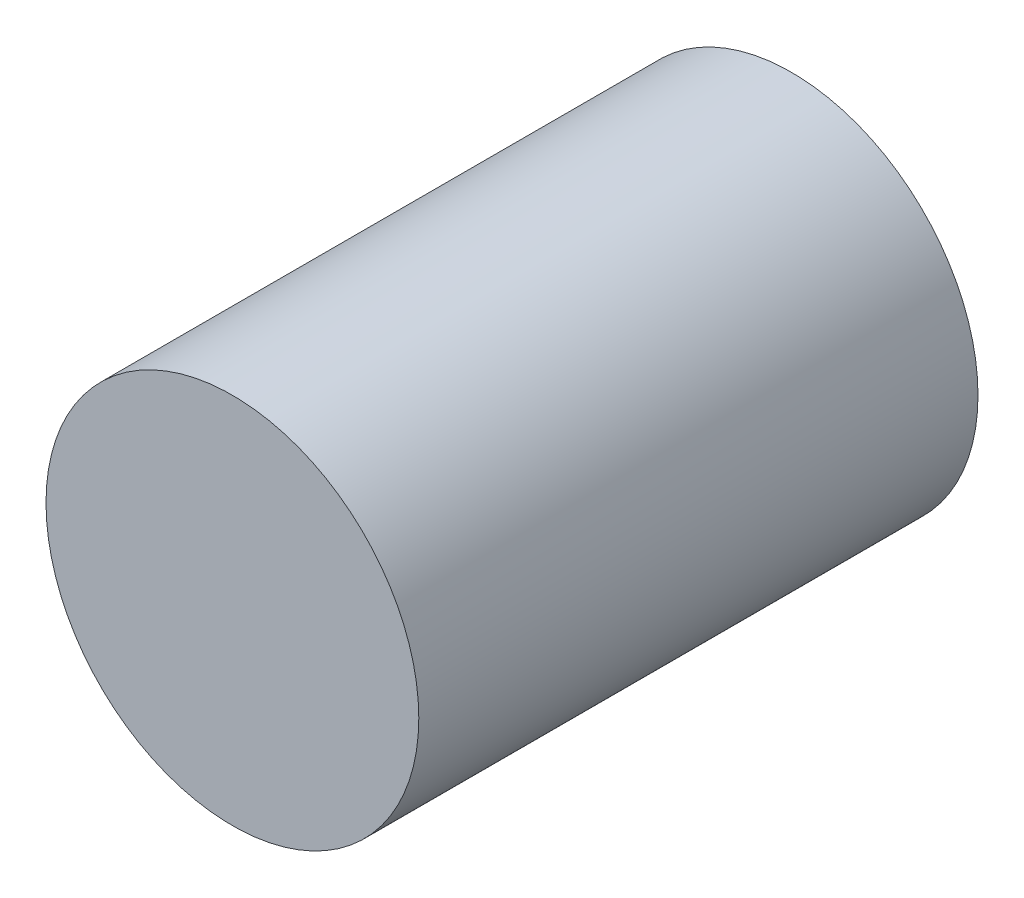
ISO-10303-21;
HEADER;
FILE_DESCRIPTION(('STEP AP214'),'2;1');
FILE_NAME('part.step','',(''),(''),'','','');
FILE_SCHEMA(('AUTOMOTIVE_DESIGN { 1 0 10303 214 1 1 1 1 }'));
ENDSEC;
DATA;
#1=APPLICATION_CONTEXT('core data for automotive mechanical design processes');
#2=APPLICATION_PROTOCOL_DEFINITION('international standard','automotive_design',2000,#1);
#3=PRODUCT_CONTEXT('',#1,'mechanical');
#4=PRODUCT('Part','Part','',(#3));
#5=PRODUCT_RELATED_PRODUCT_CATEGORY('part','',(#4));
#6=PRODUCT_DEFINITION_FORMATION('','',#4);
#7=PRODUCT_DEFINITION_CONTEXT('part definition',#1,'design');
#8=PRODUCT_DEFINITION('design','',#6,#7);
#9=PRODUCT_DEFINITION_SHAPE('','',#8);
#10=(LENGTH_UNIT() NAMED_UNIT(*) SI_UNIT(.MILLI.,.METRE.));
#11=(NAMED_UNIT(*) PLANE_ANGLE_UNIT() SI_UNIT($,.RADIAN.));
#12=(NAMED_UNIT(*) SI_UNIT($,.STERADIAN.) SOLID_ANGLE_UNIT());
#13=UNCERTAINTY_MEASURE_WITH_UNIT(LENGTH_MEASURE(1.E-05),#10,'distance_accuracy_value','');
#14=(GEOMETRIC_REPRESENTATION_CONTEXT(3) GLOBAL_UNCERTAINTY_ASSIGNED_CONTEXT((#13)) GLOBAL_UNIT_ASSIGNED_CONTEXT((#10,
#11,#12)) REPRESENTATION_CONTEXT('',''));
#15=CARTESIAN_POINT('',(0.,0.,0.));
#16=DIRECTION('',(0.,0.,1.));
#17=DIRECTION('',(1.,0.,0.));
#18=AXIS2_PLACEMENT_3D('',#15,#16,#17);
#19=CARTESIAN_POINT('',(0.,0.,24.));
#20=DIRECTION('',(0.,0.,-1.));
#21=DIRECTION('',(-1.,0.,0.));
#22=AXIS2_PLACEMENT_3D('',#19,#20,#21);
#23=CYLINDRICAL_SURFACE('',#22,8.);
#24=CARTESIAN_POINT('',(0.,0.,24.));
#25=DIRECTION('',(0.,0.,1.));
#26=DIRECTION('',(1.,0.,0.));
#27=AXIS2_PLACEMENT_3D('',#24,#25,#26);
#28=CIRCLE('',#27,8.);
#29=CARTESIAN_POINT('',(8.,0.,24.));
#30=VERTEX_POINT('',#29);
#31=EDGE_CURVE('E10',#30,#30,#28,.T.);
#32=ORIENTED_EDGE('',*,*,#31,.F.);
#33=EDGE_LOOP('',(#32));
#34=FACE_BOUND('',#33,.T.);
#35=CARTESIAN_POINT('',(0.,0.,0.));
#36=DIRECTION('',(0.,0.,1.));
#37=DIRECTION('',(1.,0.,0.));
#38=AXIS2_PLACEMENT_3D('',#35,#36,#37);
#39=CIRCLE('',#38,8.);
#40=CARTESIAN_POINT('',(8.,0.,0.));
#41=VERTEX_POINT('',#40);
#42=EDGE_CURVE('E40',#41,#41,#39,.T.);
#43=ORIENTED_EDGE('',*,*,#42,.T.);
#44=EDGE_LOOP('',(#43));
#45=FACE_BOUND('',#44,.T.);
#46=ADVANCED_FACE('F37',(#34,#45),#23,.T.);
#47=CARTESIAN_POINT('',(0.,0.,24.));
#48=DIRECTION('',(0.,0.,1.));
#49=DIRECTION('',(1.,0.,0.));
#50=AXIS2_PLACEMENT_3D('',#47,#48,#49);
#51=PLANE('',#50);
#52=ORIENTED_EDGE('',*,*,#31,.T.);
#53=EDGE_LOOP('',(#52));
#54=FACE_BOUND('',#53,.T.);
#55=ADVANCED_FACE('F52',(#54),#51,.T.);
#56=CARTESIAN_POINT('',(0.,0.,0.));
#57=DIRECTION('',(0.,0.,1.));
#58=DIRECTION('',(1.,0.,0.));
#59=AXIS2_PLACEMENT_3D('',#56,#57,#58);
#60=PLANE('',#59);
#61=ORIENTED_EDGE('',*,*,#42,.F.);
#62=EDGE_LOOP('',(#61));
#63=FACE_BOUND('',#62,.T.);
#64=ADVANCED_FACE('F50',(#63),#60,.F.);
#65=CLOSED_SHELL('',(#46,#55,#64));
#66=MANIFOLD_SOLID_BREP('B2',#65);
#67=ADVANCED_BREP_SHAPE_REPRESENTATION('',(#18,#66),#14);
#68=SHAPE_DEFINITION_REPRESENTATION(#9,#67);
ENDSEC;
END-ISO-10303-21;
